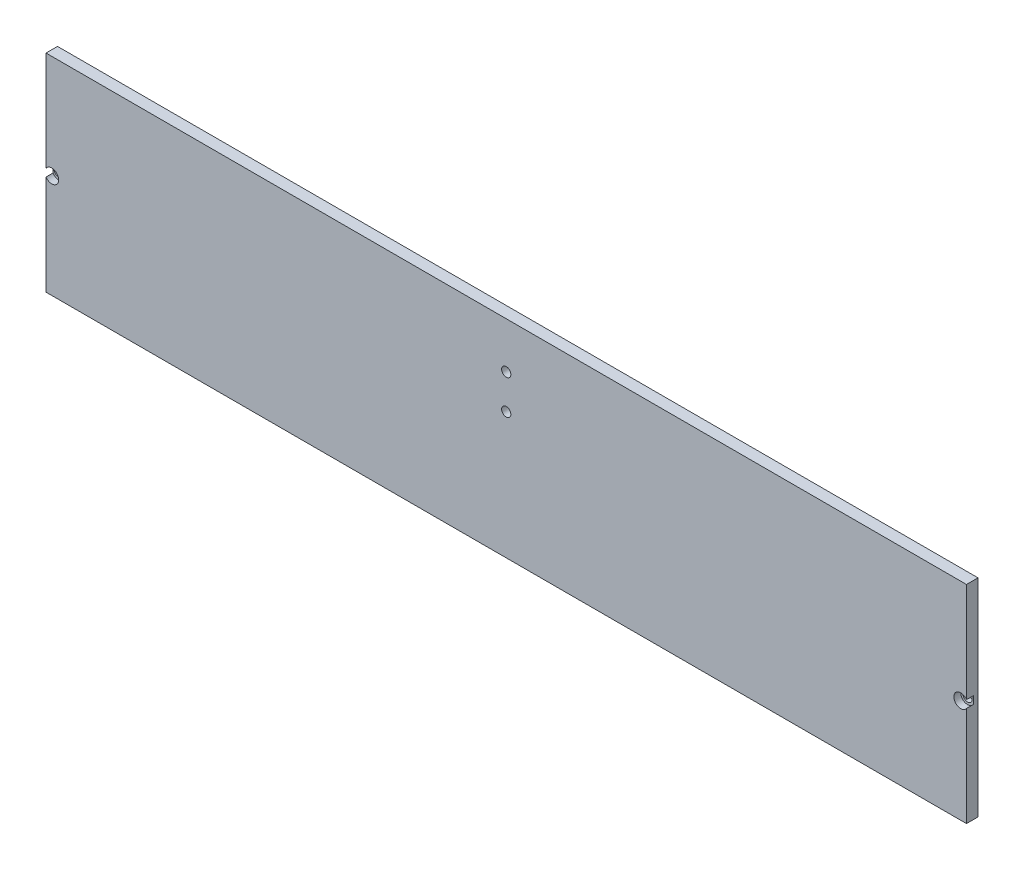
ISO-10303-21;
HEADER;
FILE_DESCRIPTION(('STEP AP214'),'2;1');
FILE_NAME('part.step','',(''),(''),'','','');
FILE_SCHEMA(('AUTOMOTIVE_DESIGN { 1 0 10303 214 1 1 1 1 }'));
ENDSEC;
DATA;
#1=APPLICATION_CONTEXT('core data for automotive mechanical design processes');
#2=APPLICATION_PROTOCOL_DEFINITION('international standard','automotive_design',2000,#1);
#3=PRODUCT_CONTEXT('',#1,'mechanical');
#4=PRODUCT('Part','Part','',(#3));
#5=PRODUCT_RELATED_PRODUCT_CATEGORY('part','',(#4));
#6=PRODUCT_DEFINITION_FORMATION('','',#4);
#7=PRODUCT_DEFINITION_CONTEXT('part definition',#1,'design');
#8=PRODUCT_DEFINITION('design','',#6,#7);
#9=PRODUCT_DEFINITION_SHAPE('','',#8);
#10=(LENGTH_UNIT() NAMED_UNIT(*) SI_UNIT(.MILLI.,.METRE.));
#11=(NAMED_UNIT(*) PLANE_ANGLE_UNIT() SI_UNIT($,.RADIAN.));
#12=(NAMED_UNIT(*) SI_UNIT($,.STERADIAN.) SOLID_ANGLE_UNIT());
#13=UNCERTAINTY_MEASURE_WITH_UNIT(LENGTH_MEASURE(1.E-05),#10,'distance_accuracy_value','');
#14=(GEOMETRIC_REPRESENTATION_CONTEXT(3) GLOBAL_UNCERTAINTY_ASSIGNED_CONTEXT((#13)) GLOBAL_UNIT_ASSIGNED_CONTEXT((#10,
#11,#12)) REPRESENTATION_CONTEXT('',''));
#15=CARTESIAN_POINT('',(0.,0.,0.));
#16=DIRECTION('',(0.,0.,1.));
#17=DIRECTION('',(1.,0.,0.));
#18=AXIS2_PLACEMENT_3D('',#15,#16,#17);
#19=CARTESIAN_POINT('',(397.5,45.,5.));
#20=DIRECTION('',(0.,0.,-1.));
#21=DIRECTION('',(-1.,0.,0.));
#22=AXIS2_PLACEMENT_3D('',#19,#20,#21);
#23=CYLINDRICAL_SURFACE('',#22,2.);
#24=CARTESIAN_POINT('',(397.5,45.,0.));
#25=DIRECTION('',(0.,0.,1.));
#26=DIRECTION('',(1.,0.,0.));
#27=AXIS2_PLACEMENT_3D('',#24,#25,#26);
#28=CIRCLE('',#27,2.);
#29=CARTESIAN_POINT('',(399.5,45.,0.));
#30=VERTEX_POINT('',#29);
#31=EDGE_CURVE('E203',#30,#30,#28,.T.);
#32=ORIENTED_EDGE('',*,*,#31,.F.);
#33=EDGE_LOOP('',(#32));
#34=FACE_BOUND('',#33,.T.);
#35=CARTESIAN_POINT('',(397.5,45.,2.));
#36=DIRECTION('',(0.,0.,1.));
#37=DIRECTION('',(1.,0.,0.));
#38=AXIS2_PLACEMENT_3D('',#35,#36,#37);
#39=CIRCLE('',#38,2.);
#40=CARTESIAN_POINT('',(399.5,45.,2.));
#41=VERTEX_POINT('',#40);
#42=EDGE_CURVE('E231',#41,#41,#39,.T.);
#43=ORIENTED_EDGE('',*,*,#42,.T.);
#44=EDGE_LOOP('',(#43));
#45=FACE_BOUND('',#44,.T.);
#46=ADVANCED_FACE('F99',(#34,#45),#23,.F.);
#47=CARTESIAN_POINT('',(2.5,45.,5.));
#48=DIRECTION('',(0.,0.,-1.));
#49=DIRECTION('',(-1.,0.,0.));
#50=AXIS2_PLACEMENT_3D('',#47,#48,#49);
#51=CYLINDRICAL_SURFACE('',#50,2.);
#52=CARTESIAN_POINT('',(2.5,45.,0.));
#53=DIRECTION('',(0.,0.,1.));
#54=DIRECTION('',(1.,0.,0.));
#55=AXIS2_PLACEMENT_3D('',#52,#53,#54);
#56=CIRCLE('',#55,2.);
#57=CARTESIAN_POINT('',(4.5,45.,0.));
#58=VERTEX_POINT('',#57);
#59=EDGE_CURVE('E273',#58,#58,#56,.T.);
#60=ORIENTED_EDGE('',*,*,#59,.F.);
#61=EDGE_LOOP('',(#60));
#62=FACE_BOUND('',#61,.T.);
#63=CARTESIAN_POINT('',(2.5,45.,2.));
#64=DIRECTION('',(0.,0.,1.));
#65=DIRECTION('',(1.,0.,0.));
#66=AXIS2_PLACEMENT_3D('',#63,#64,#65);
#67=CIRCLE('',#66,2.);
#68=CARTESIAN_POINT('',(4.5,45.,2.));
#69=VERTEX_POINT('',#68);
#70=EDGE_CURVE('E227',#69,#69,#67,.T.);
#71=ORIENTED_EDGE('',*,*,#70,.T.);
#72=EDGE_LOOP('',(#71));
#73=FACE_BOUND('',#72,.T.);
#74=ADVANCED_FACE('F347',(#62,#73),#51,.F.);
#75=CARTESIAN_POINT('',(0.,0.,5.));
#76=DIRECTION('',(0.,0.,1.));
#77=DIRECTION('',(1.,0.,0.));
#78=AXIS2_PLACEMENT_3D('',#75,#76,#77);
#79=PLANE('',#78);
#80=CARTESIAN_POINT('',(2.5,45.,5.));
#81=DIRECTION('',(0.,0.,1.));
#82=DIRECTION('',(1.,0.,0.));
#83=AXIS2_PLACEMENT_3D('',#80,#81,#82);
#84=CIRCLE('',#83,3.);
#85=CARTESIAN_POINT('',(0.,43.3416876048223,5.));
#86=VERTEX_POINT('',#85);
#87=CARTESIAN_POINT('',(0.,46.6583123951777,5.));
#88=VERTEX_POINT('',#87);
#89=EDGE_CURVE('E163',#86,#88,#84,.T.);
#90=ORIENTED_EDGE('',*,*,#89,.F.);
#91=DIRECTION('',(0.,1.,0.));
#92=VECTOR('',#91,1.);
#93=CARTESIAN_POINT('',(0.,0.,5.));
#94=LINE('',#93,#92);
#95=CARTESIAN_POINT('',(0.,0.,5.));
#96=VERTEX_POINT('',#95);
#97=EDGE_CURVE('E188',#96,#86,#94,.T.);
#98=ORIENTED_EDGE('',*,*,#97,.F.);
#99=DIRECTION('',(1.,0.,0.));
#100=VECTOR('',#99,1.);
#101=CARTESIAN_POINT('',(0.,0.,5.));
#102=LINE('',#101,#100);
#103=CARTESIAN_POINT('',(400.,0.,5.));
#104=VERTEX_POINT('',#103);
#105=EDGE_CURVE('E189',#96,#104,#102,.T.);
#106=ORIENTED_EDGE('',*,*,#105,.T.);
#107=DIRECTION('',(0.,1.,0.));
#108=VECTOR('',#107,1.);
#109=CARTESIAN_POINT('',(400.,0.,5.));
#110=LINE('',#109,#108);
#111=CARTESIAN_POINT('',(400.,43.3416876048223,5.));
#112=VERTEX_POINT('',#111);
#113=EDGE_CURVE('E194',#104,#112,#110,.T.);
#114=ORIENTED_EDGE('',*,*,#113,.T.);
#115=CARTESIAN_POINT('',(397.5,45.,5.));
#116=DIRECTION('',(0.,0.,1.));
#117=DIRECTION('',(1.,0.,0.));
#118=AXIS2_PLACEMENT_3D('',#115,#116,#117);
#119=CIRCLE('',#118,2.99999999999999);
#120=CARTESIAN_POINT('',(400.,46.6583123951777,5.));
#121=VERTEX_POINT('',#120);
#122=EDGE_CURVE('E173',#121,#112,#119,.T.);
#123=ORIENTED_EDGE('',*,*,#122,.F.);
#124=CARTESIAN_POINT('',(400.,90.,5.));
#125=VERTEX_POINT('',#124);
#126=EDGE_CURVE('E252',#121,#125,#110,.T.);
#127=ORIENTED_EDGE('',*,*,#126,.T.);
#128=DIRECTION('',(1.,0.,0.));
#129=VECTOR('',#128,1.);
#130=CARTESIAN_POINT('',(0.,90.,5.));
#131=LINE('',#130,#129);
#132=CARTESIAN_POINT('',(0.,90.,5.));
#133=VERTEX_POINT('',#132);
#134=EDGE_CURVE('E186',#133,#125,#131,.T.);
#135=ORIENTED_EDGE('',*,*,#134,.F.);
#136=EDGE_CURVE('E177',#88,#133,#94,.T.);
#137=ORIENTED_EDGE('',*,*,#136,.F.);
#138=EDGE_LOOP('',(#90,#98,#106,#114,#123,#127,#135,#137));
#139=FACE_BOUND('',#138,.T.);
#140=CARTESIAN_POINT('',(200.,55.,5.));
#141=DIRECTION('',(0.,0.,1.));
#142=DIRECTION('',(1.,0.,0.));
#143=AXIS2_PLACEMENT_3D('',#140,#141,#142);
#144=CIRCLE('',#143,2.);
#145=CARTESIAN_POINT('',(202.,55.,5.));
#146=VERTEX_POINT('',#145);
#147=EDGE_CURVE('E265',#146,#146,#144,.T.);
#148=ORIENTED_EDGE('',*,*,#147,.F.);
#149=EDGE_LOOP('',(#148));
#150=FACE_BOUND('',#149,.T.);
#151=CARTESIAN_POINT('',(200.,70.,5.));
#152=DIRECTION('',(0.,0.,1.));
#153=DIRECTION('',(1.,0.,0.));
#154=AXIS2_PLACEMENT_3D('',#151,#152,#153);
#155=CIRCLE('',#154,2.);
#156=CARTESIAN_POINT('',(202.,70.,5.));
#157=VERTEX_POINT('',#156);
#158=EDGE_CURVE('E260',#157,#157,#155,.T.);
#159=ORIENTED_EDGE('',*,*,#158,.F.);
#160=EDGE_LOOP('',(#159));
#161=FACE_BOUND('',#160,.T.);
#162=ADVANCED_FACE('F183',(#139,#150,#161),#79,.T.);
#163=CARTESIAN_POINT('',(0.,0.,0.));
#164=DIRECTION('',(0.,0.,1.));
#165=DIRECTION('',(1.,0.,0.));
#166=AXIS2_PLACEMENT_3D('',#163,#164,#165);
#167=PLANE('',#166);
#168=DIRECTION('',(1.,0.,0.));
#169=VECTOR('',#168,1.);
#170=CARTESIAN_POINT('',(0.,90.,0.));
#171=LINE('',#170,#169);
#172=CARTESIAN_POINT('',(0.,90.,0.));
#173=VERTEX_POINT('',#172);
#174=CARTESIAN_POINT('',(400.,90.,0.));
#175=VERTEX_POINT('',#174);
#176=EDGE_CURVE('E198',#173,#175,#171,.T.);
#177=ORIENTED_EDGE('',*,*,#176,.T.);
#178=DIRECTION('',(0.,1.,0.));
#179=VECTOR('',#178,1.);
#180=CARTESIAN_POINT('',(400.,0.,0.));
#181=LINE('',#180,#179);
#182=CARTESIAN_POINT('',(400.,0.,0.));
#183=VERTEX_POINT('',#182);
#184=EDGE_CURVE('E202',#183,#175,#181,.T.);
#185=ORIENTED_EDGE('',*,*,#184,.F.);
#186=DIRECTION('',(1.,0.,0.));
#187=VECTOR('',#186,1.);
#188=CARTESIAN_POINT('',(0.,0.,0.));
#189=LINE('',#188,#187);
#190=CARTESIAN_POINT('',(0.,0.,0.));
#191=VERTEX_POINT('',#190);
#192=EDGE_CURVE('E207',#191,#183,#189,.T.);
#193=ORIENTED_EDGE('',*,*,#192,.F.);
#194=DIRECTION('',(0.,1.,0.));
#195=VECTOR('',#194,1.);
#196=CARTESIAN_POINT('',(0.,0.,0.));
#197=LINE('',#196,#195);
#198=EDGE_CURVE('E210',#191,#173,#197,.T.);
#199=ORIENTED_EDGE('',*,*,#198,.T.);
#200=EDGE_LOOP('',(#177,#185,#193,#199));
#201=FACE_BOUND('',#200,.T.);
#202=ORIENTED_EDGE('',*,*,#31,.T.);
#203=EDGE_LOOP('',(#202));
#204=FACE_BOUND('',#203,.T.);
#205=CARTESIAN_POINT('',(200.,70.,0.));
#206=DIRECTION('',(0.,0.,1.));
#207=DIRECTION('',(1.,0.,0.));
#208=AXIS2_PLACEMENT_3D('',#205,#206,#207);
#209=CIRCLE('',#208,2.);
#210=CARTESIAN_POINT('',(202.,70.,0.));
#211=VERTEX_POINT('',#210);
#212=EDGE_CURVE('E261',#211,#211,#209,.T.);
#213=ORIENTED_EDGE('',*,*,#212,.T.);
#214=EDGE_LOOP('',(#213));
#215=FACE_BOUND('',#214,.T.);
#216=CARTESIAN_POINT('',(200.,55.,0.));
#217=DIRECTION('',(0.,0.,1.));
#218=DIRECTION('',(1.,0.,0.));
#219=AXIS2_PLACEMENT_3D('',#216,#217,#218);
#220=CIRCLE('',#219,2.);
#221=CARTESIAN_POINT('',(202.,55.,0.));
#222=VERTEX_POINT('',#221);
#223=EDGE_CURVE('E269',#222,#222,#220,.T.);
#224=ORIENTED_EDGE('',*,*,#223,.T.);
#225=EDGE_LOOP('',(#224));
#226=FACE_BOUND('',#225,.T.);
#227=ORIENTED_EDGE('',*,*,#59,.T.);
#228=EDGE_LOOP('',(#227));
#229=FACE_BOUND('',#228,.T.);
#230=ADVANCED_FACE('F327',(#201,#204,#215,#226,#229),#167,.F.);
#231=CARTESIAN_POINT('',(0.,90.,5.));
#232=DIRECTION('',(0.,1.,0.));
#233=DIRECTION('',(0.,0.,1.));
#234=AXIS2_PLACEMENT_3D('',#231,#232,#233);
#235=PLANE('',#234);
#236=ORIENTED_EDGE('',*,*,#176,.F.);
#237=DIRECTION('',(0.,0.,-1.));
#238=VECTOR('',#237,1.);
#239=CARTESIAN_POINT('',(0.,90.,5.));
#240=LINE('',#239,#238);
#241=EDGE_CURVE('E214',#133,#173,#240,.T.);
#242=ORIENTED_EDGE('',*,*,#241,.F.);
#243=ORIENTED_EDGE('',*,*,#134,.T.);
#244=DIRECTION('',(0.,0.,-1.));
#245=VECTOR('',#244,1.);
#246=CARTESIAN_POINT('',(400.,90.,5.));
#247=LINE('',#246,#245);
#248=EDGE_CURVE('E193',#125,#175,#247,.T.);
#249=ORIENTED_EDGE('',*,*,#248,.T.);
#250=EDGE_LOOP('',(#236,#242,#243,#249));
#251=FACE_BOUND('',#250,.T.);
#252=ADVANCED_FACE('F101',(#251),#235,.T.);
#253=CARTESIAN_POINT('',(0.,0.,5.));
#254=DIRECTION('',(-1.,0.,0.));
#255=DIRECTION('',(0.,0.,1.));
#256=AXIS2_PLACEMENT_3D('',#253,#254,#255);
#257=PLANE('',#256);
#258=DIRECTION('',(0.,0.,1.));
#259=VECTOR('',#258,1.);
#260=CARTESIAN_POINT('',(0.,43.3416876048223,2.));
#261=LINE('',#260,#259);
#262=CARTESIAN_POINT('',(0.,43.3416876048223,2.));
#263=VERTEX_POINT('',#262);
#264=EDGE_CURVE('E12',#263,#86,#261,.T.);
#265=ORIENTED_EDGE('',*,*,#264,.F.);
#266=DIRECTION('',(0.,1.,0.));
#267=VECTOR('',#266,1.);
#268=CARTESIAN_POINT('',(0.,0.,2.));
#269=LINE('',#268,#267);
#270=CARTESIAN_POINT('',(0.,46.6583123951777,2.));
#271=VERTEX_POINT('',#270);
#272=EDGE_CURVE('E179',#263,#271,#269,.T.);
#273=ORIENTED_EDGE('',*,*,#272,.T.);
#274=DIRECTION('',(0.,0.,1.));
#275=VECTOR('',#274,1.);
#276=CARTESIAN_POINT('',(0.,46.6583123951777,2.));
#277=LINE('',#276,#275);
#278=EDGE_CURVE('E108',#88,#271,#277,.F.);
#279=ORIENTED_EDGE('',*,*,#278,.F.);
#280=ORIENTED_EDGE('',*,*,#136,.T.);
#281=ORIENTED_EDGE('',*,*,#241,.T.);
#282=ORIENTED_EDGE('',*,*,#198,.F.);
#283=DIRECTION('',(0.,0.,-1.));
#284=VECTOR('',#283,1.);
#285=CARTESIAN_POINT('',(0.,0.,5.));
#286=LINE('',#285,#284);
#287=EDGE_CURVE('E218',#96,#191,#286,.T.);
#288=ORIENTED_EDGE('',*,*,#287,.F.);
#289=ORIENTED_EDGE('',*,*,#97,.T.);
#290=EDGE_LOOP('',(#265,#273,#279,#280,#281,#282,#288,#289));
#291=FACE_BOUND('',#290,.T.);
#292=ADVANCED_FACE('F176',(#291),#257,.T.);
#293=CARTESIAN_POINT('',(0.,0.,5.));
#294=DIRECTION('',(0.,1.,0.));
#295=DIRECTION('',(0.,0.,1.));
#296=AXIS2_PLACEMENT_3D('',#293,#294,#295);
#297=PLANE('',#296);
#298=CARTESIAN_POINT('',(40.,0.,2.5));
#299=DIRECTION('',(0.,-1.,0.));
#300=DIRECTION('',(0.,0.,-1.));
#301=AXIS2_PLACEMENT_3D('',#298,#299,#300);
#302=CIRCLE('',#301,1.25);
#303=CARTESIAN_POINT('',(40.,0.,1.25));
#304=VERTEX_POINT('',#303);
#305=EDGE_CURVE('E299',#304,#304,#302,.T.);
#306=ORIENTED_EDGE('',*,*,#305,.F.);
#307=EDGE_LOOP('',(#306));
#308=FACE_BOUND('',#307,.T.);
#309=CARTESIAN_POINT('',(360.,0.,2.5));
#310=DIRECTION('',(0.,-1.,0.));
#311=DIRECTION('',(0.,0.,-1.));
#312=AXIS2_PLACEMENT_3D('',#309,#310,#311);
#313=CIRCLE('',#312,1.24999999999996);
#314=CARTESIAN_POINT('',(360.,0.,1.25000000000004));
#315=VERTEX_POINT('',#314);
#316=EDGE_CURVE('E291',#315,#315,#313,.T.);
#317=ORIENTED_EDGE('',*,*,#316,.F.);
#318=EDGE_LOOP('',(#317));
#319=FACE_BOUND('',#318,.T.);
#320=ORIENTED_EDGE('',*,*,#192,.T.);
#321=DIRECTION('',(0.,0.,-1.));
#322=VECTOR('',#321,1.);
#323=CARTESIAN_POINT('',(400.,0.,5.));
#324=LINE('',#323,#322);
#325=EDGE_CURVE('E221',#104,#183,#324,.T.);
#326=ORIENTED_EDGE('',*,*,#325,.F.);
#327=ORIENTED_EDGE('',*,*,#105,.F.);
#328=ORIENTED_EDGE('',*,*,#287,.T.);
#329=EDGE_LOOP('',(#320,#326,#327,#328));
#330=FACE_BOUND('',#329,.T.);
#331=ADVANCED_FACE('F316',(#308,#319,#330),#297,.F.);
#332=CARTESIAN_POINT('',(400.,0.,5.));
#333=DIRECTION('',(-1.,0.,0.));
#334=DIRECTION('',(0.,0.,1.));
#335=AXIS2_PLACEMENT_3D('',#332,#333,#334);
#336=PLANE('',#335);
#337=DIRECTION('',(0.,1.,0.));
#338=VECTOR('',#337,1.);
#339=CARTESIAN_POINT('',(400.,0.,2.));
#340=LINE('',#339,#338);
#341=CARTESIAN_POINT('',(400.,43.3416876048223,2.));
#342=VERTEX_POINT('',#341);
#343=CARTESIAN_POINT('',(400.,46.6583123951777,2.));
#344=VERTEX_POINT('',#343);
#345=EDGE_CURVE('E235',#342,#344,#340,.T.);
#346=ORIENTED_EDGE('',*,*,#345,.F.);
#347=DIRECTION('',(0.,0.,1.));
#348=VECTOR('',#347,1.);
#349=CARTESIAN_POINT('',(400.,43.3416876048223,2.));
#350=LINE('',#349,#348);
#351=EDGE_CURVE('E181',#342,#112,#350,.T.);
#352=ORIENTED_EDGE('',*,*,#351,.T.);
#353=ORIENTED_EDGE('',*,*,#113,.F.);
#354=ORIENTED_EDGE('',*,*,#325,.T.);
#355=ORIENTED_EDGE('',*,*,#184,.T.);
#356=ORIENTED_EDGE('',*,*,#248,.F.);
#357=ORIENTED_EDGE('',*,*,#126,.F.);
#358=DIRECTION('',(0.,0.,1.));
#359=VECTOR('',#358,1.);
#360=CARTESIAN_POINT('',(400.,46.6583123951777,2.));
#361=LINE('',#360,#359);
#362=EDGE_CURVE('E217',#121,#344,#361,.F.);
#363=ORIENTED_EDGE('',*,*,#362,.T.);
#364=EDGE_LOOP('',(#346,#352,#353,#354,#355,#356,#357,#363));
#365=FACE_BOUND('',#364,.T.);
#366=ADVANCED_FACE('F245',(#365),#336,.F.);
#367=CARTESIAN_POINT('',(200.,70.,5.));
#368=DIRECTION('',(0.,0.,-1.));
#369=DIRECTION('',(-1.,0.,0.));
#370=AXIS2_PLACEMENT_3D('',#367,#368,#369);
#371=CYLINDRICAL_SURFACE('',#370,2.);
#372=ORIENTED_EDGE('',*,*,#158,.T.);
#373=EDGE_LOOP('',(#372));
#374=FACE_BOUND('',#373,.T.);
#375=ORIENTED_EDGE('',*,*,#212,.F.);
#376=EDGE_LOOP('',(#375));
#377=FACE_BOUND('',#376,.T.);
#378=ADVANCED_FACE('F359',(#374,#377),#371,.F.);
#379=CARTESIAN_POINT('',(200.,55.,5.));
#380=DIRECTION('',(0.,0.,-1.));
#381=DIRECTION('',(-1.,0.,0.));
#382=AXIS2_PLACEMENT_3D('',#379,#380,#381);
#383=CYLINDRICAL_SURFACE('',#382,2.);
#384=ORIENTED_EDGE('',*,*,#147,.T.);
#385=EDGE_LOOP('',(#384));
#386=FACE_BOUND('',#385,.T.);
#387=ORIENTED_EDGE('',*,*,#223,.F.);
#388=EDGE_LOOP('',(#387));
#389=FACE_BOUND('',#388,.T.);
#390=ADVANCED_FACE('F370',(#386,#389),#383,.F.);
#391=CARTESIAN_POINT('',(2.5,45.,2.));
#392=DIRECTION('',(0.,0.,1.));
#393=DIRECTION('',(1.,0.,0.));
#394=AXIS2_PLACEMENT_3D('',#391,#392,#393);
#395=CYLINDRICAL_SURFACE('',#394,3.);
#396=ORIENTED_EDGE('',*,*,#264,.T.);
#397=ORIENTED_EDGE('',*,*,#89,.T.);
#398=ORIENTED_EDGE('',*,*,#278,.T.);
#399=CARTESIAN_POINT('',(2.5,45.,2.));
#400=DIRECTION('',(0.,0.,1.));
#401=DIRECTION('',(1.,0.,0.));
#402=AXIS2_PLACEMENT_3D('',#399,#400,#401);
#403=CIRCLE('',#402,3.);
#404=EDGE_CURVE('E114',#263,#271,#403,.T.);
#405=ORIENTED_EDGE('',*,*,#404,.F.);
#406=EDGE_LOOP('',(#396,#397,#398,#405));
#407=FACE_BOUND('',#406,.T.);
#408=ADVANCED_FACE('F165',(#407),#395,.F.);
#409=CARTESIAN_POINT('',(2.5,45.,2.));
#410=DIRECTION('',(0.,0.,1.));
#411=DIRECTION('',(1.,0.,0.));
#412=AXIS2_PLACEMENT_3D('',#409,#410,#411);
#413=PLANE('',#412);
#414=ORIENTED_EDGE('',*,*,#70,.F.);
#415=EDGE_LOOP('',(#414));
#416=FACE_BOUND('',#415,.T.);
#417=ORIENTED_EDGE('',*,*,#404,.T.);
#418=ORIENTED_EDGE('',*,*,#272,.F.);
#419=EDGE_LOOP('',(#417,#418));
#420=FACE_BOUND('',#419,.T.);
#421=ADVANCED_FACE('F334',(#416,#420),#413,.T.);
#422=CARTESIAN_POINT('',(397.5,45.,2.));
#423=DIRECTION('',(0.,0.,1.));
#424=DIRECTION('',(1.,0.,0.));
#425=AXIS2_PLACEMENT_3D('',#422,#423,#424);
#426=CYLINDRICAL_SURFACE('',#425,2.99999999999999);
#427=CARTESIAN_POINT('',(397.5,45.,2.));
#428=DIRECTION('',(0.,0.,1.));
#429=DIRECTION('',(1.,0.,0.));
#430=AXIS2_PLACEMENT_3D('',#427,#428,#429);
#431=CIRCLE('',#430,2.99999999999999);
#432=EDGE_CURVE('E121',#344,#342,#431,.T.);
#433=ORIENTED_EDGE('',*,*,#432,.F.);
#434=ORIENTED_EDGE('',*,*,#362,.F.);
#435=ORIENTED_EDGE('',*,*,#122,.T.);
#436=ORIENTED_EDGE('',*,*,#351,.F.);
#437=EDGE_LOOP('',(#433,#434,#435,#436));
#438=FACE_BOUND('',#437,.T.);
#439=ADVANCED_FACE('F331',(#438),#426,.F.);
#440=CARTESIAN_POINT('',(397.5,45.,2.));
#441=DIRECTION('',(0.,0.,1.));
#442=DIRECTION('',(1.,0.,0.));
#443=AXIS2_PLACEMENT_3D('',#440,#441,#442);
#444=PLANE('',#443);
#445=ORIENTED_EDGE('',*,*,#42,.F.);
#446=EDGE_LOOP('',(#445));
#447=FACE_BOUND('',#446,.T.);
#448=ORIENTED_EDGE('',*,*,#345,.T.);
#449=ORIENTED_EDGE('',*,*,#432,.T.);
#450=EDGE_LOOP('',(#448,#449));
#451=FACE_BOUND('',#450,.T.);
#452=ADVANCED_FACE('F333',(#447,#451),#444,.T.);
#453=CARTESIAN_POINT('',(360.,15.,2.5));
#454=DIRECTION('',(0.,-1.,0.));
#455=DIRECTION('',(0.,0.,-1.));
#456=AXIS2_PLACEMENT_3D('',#453,#454,#455);
#457=CYLINDRICAL_SURFACE('',#456,1.24999999999996);
#458=CARTESIAN_POINT('',(360.,15.,2.5));
#459=DIRECTION('',(0.,-1.,0.));
#460=DIRECTION('',(0.,0.,-1.));
#461=AXIS2_PLACEMENT_3D('',#458,#459,#460);
#462=CIRCLE('',#461,1.24999999999996);
#463=CARTESIAN_POINT('',(360.,15.,1.25000000000004));
#464=VERTEX_POINT('',#463);
#465=EDGE_CURVE('E295',#464,#464,#462,.T.);
#466=ORIENTED_EDGE('',*,*,#465,.F.);
#467=EDGE_LOOP('',(#466));
#468=FACE_BOUND('',#467,.T.);
#469=ORIENTED_EDGE('',*,*,#316,.T.);
#470=EDGE_LOOP('',(#469));
#471=FACE_BOUND('',#470,.T.);
#472=ADVANCED_FACE('F340',(#468,#471),#457,.F.);
#473=CARTESIAN_POINT('',(360.,15.,2.5));
#474=DIRECTION('',(0.,-1.,0.));
#475=DIRECTION('',(0.,0.,-1.));
#476=AXIS2_PLACEMENT_3D('',#473,#474,#475);
#477=PLANE('',#476);
#478=ORIENTED_EDGE('',*,*,#465,.T.);
#479=EDGE_LOOP('',(#478));
#480=FACE_BOUND('',#479,.T.);
#481=ADVANCED_FACE('F312',(#480),#477,.T.);
#482=CARTESIAN_POINT('',(40.,15.,2.5));
#483=DIRECTION('',(0.,-1.,0.));
#484=DIRECTION('',(0.,0.,-1.));
#485=AXIS2_PLACEMENT_3D('',#482,#483,#484);
#486=CYLINDRICAL_SURFACE('',#485,1.25);
#487=CARTESIAN_POINT('',(40.,15.,2.5));
#488=DIRECTION('',(0.,-1.,0.));
#489=DIRECTION('',(0.,0.,-1.));
#490=AXIS2_PLACEMENT_3D('',#487,#488,#489);
#491=CIRCLE('',#490,1.25);
#492=CARTESIAN_POINT('',(40.,15.,1.25));
#493=VERTEX_POINT('',#492);
#494=EDGE_CURVE('E286',#493,#493,#491,.T.);
#495=ORIENTED_EDGE('',*,*,#494,.F.);
#496=EDGE_LOOP('',(#495));
#497=FACE_BOUND('',#496,.T.);
#498=ORIENTED_EDGE('',*,*,#305,.T.);
#499=EDGE_LOOP('',(#498));
#500=FACE_BOUND('',#499,.T.);
#501=ADVANCED_FACE('F309',(#497,#500),#486,.F.);
#502=CARTESIAN_POINT('',(40.,15.,2.5));
#503=DIRECTION('',(0.,-1.,0.));
#504=DIRECTION('',(0.,0.,-1.));
#505=AXIS2_PLACEMENT_3D('',#502,#503,#504);
#506=PLANE('',#505);
#507=ORIENTED_EDGE('',*,*,#494,.T.);
#508=EDGE_LOOP('',(#507));
#509=FACE_BOUND('',#508,.T.);
#510=ADVANCED_FACE('F307',(#509),#506,.T.);
#511=CLOSED_SHELL('',(#46,#74,#162,#230,#252,#292,#331,#366,#378,#390,#408,#421,#439,#452,#472,
#481,#501,#510));
#512=MANIFOLD_SOLID_BREP('B2',#511);
#513=ADVANCED_BREP_SHAPE_REPRESENTATION('',(#18,#512),#14);
#514=SHAPE_DEFINITION_REPRESENTATION(#9,#513);
ENDSEC;
END-ISO-10303-21;
